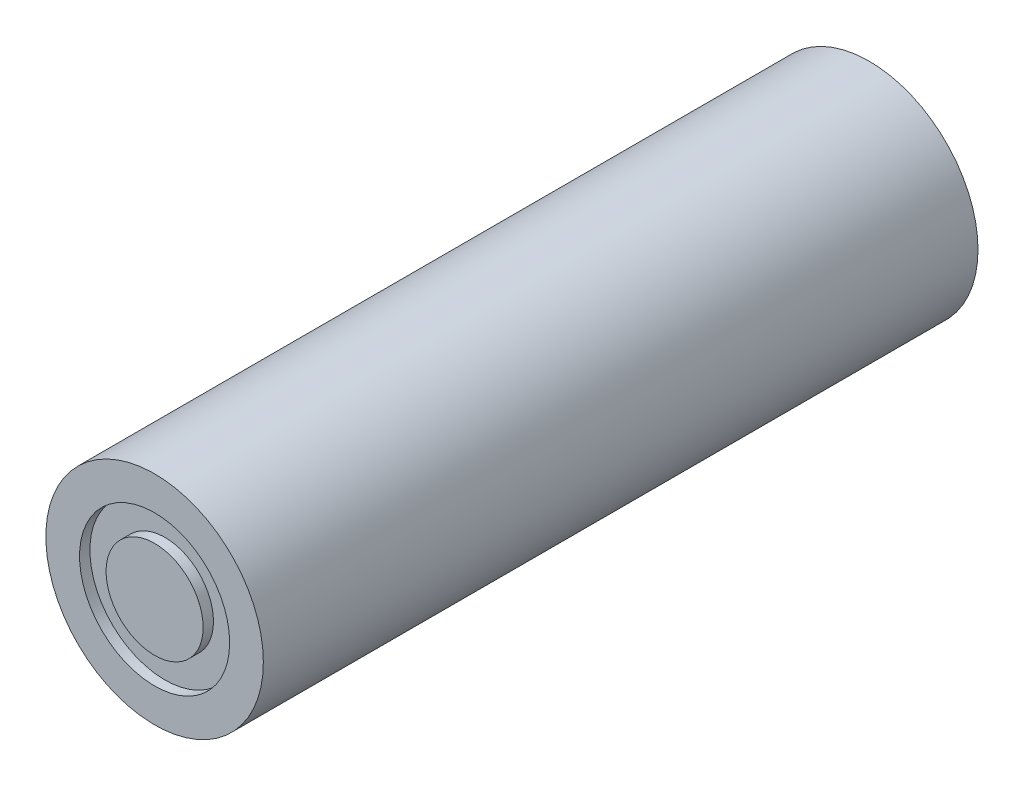
ISO-10303-21;
HEADER;
FILE_DESCRIPTION(('STEP AP214'),'2;1');
FILE_NAME('part.step','',(''),(''),'','','');
FILE_SCHEMA(('AUTOMOTIVE_DESIGN { 1 0 10303 214 1 1 1 1 }'));
ENDSEC;
DATA;
#1=APPLICATION_CONTEXT('core data for automotive mechanical design processes');
#2=APPLICATION_PROTOCOL_DEFINITION('international standard','automotive_design',2000,#1);
#3=PRODUCT_CONTEXT('',#1,'mechanical');
#4=PRODUCT('Part','Part','',(#3));
#5=PRODUCT_RELATED_PRODUCT_CATEGORY('part','',(#4));
#6=PRODUCT_DEFINITION_FORMATION('','',#4);
#7=PRODUCT_DEFINITION_CONTEXT('part definition',#1,'design');
#8=PRODUCT_DEFINITION('design','',#6,#7);
#9=PRODUCT_DEFINITION_SHAPE('','',#8);
#10=(LENGTH_UNIT() NAMED_UNIT(*) SI_UNIT(.MILLI.,.METRE.));
#11=(NAMED_UNIT(*) PLANE_ANGLE_UNIT() SI_UNIT($,.RADIAN.));
#12=(NAMED_UNIT(*) SI_UNIT($,.STERADIAN.) SOLID_ANGLE_UNIT());
#13=UNCERTAINTY_MEASURE_WITH_UNIT(LENGTH_MEASURE(1.E-05),#10,'distance_accuracy_value','');
#14=(GEOMETRIC_REPRESENTATION_CONTEXT(3) GLOBAL_UNCERTAINTY_ASSIGNED_CONTEXT((#13)) GLOBAL_UNIT_ASSIGNED_CONTEXT((#10,
#11,#12)) REPRESENTATION_CONTEXT('',''));
#15=CARTESIAN_POINT('',(0.,0.,0.));
#16=DIRECTION('',(0.,0.,1.));
#17=DIRECTION('',(1.,0.,0.));
#18=AXIS2_PLACEMENT_3D('',#15,#16,#17);
#19=CARTESIAN_POINT('',(0.,0.,35.075));
#20=DIRECTION('',(0.,0.,-1.));
#21=DIRECTION('',(-1.00000000000001,0.,0.));
#22=AXIS2_PLACEMENT_3D('',#19,#20,#21);
#23=CYLINDRICAL_SURFACE('',#22,10.674999986);
#24=CARTESIAN_POINT('',(0.,0.,35.075));
#25=DIRECTION('',(0.,0.,1.));
#26=DIRECTION('',(1.00000000000001,0.,0.));
#27=AXIS2_PLACEMENT_3D('',#24,#25,#26);
#28=CIRCLE('',#27,10.674999986);
#29=CARTESIAN_POINT('',(10.6749999860001,0.,35.075));
#30=VERTEX_POINT('',#29);
#31=EDGE_CURVE('E10',#30,#30,#28,.T.);
#32=ORIENTED_EDGE('',*,*,#31,.F.);
#33=EDGE_LOOP('',(#32));
#34=FACE_BOUND('',#33,.T.);
#35=CARTESIAN_POINT('',(0.,0.,-35.075));
#36=DIRECTION('',(0.,0.,1.));
#37=DIRECTION('',(1.00000000000001,0.,0.));
#38=AXIS2_PLACEMENT_3D('',#35,#36,#37);
#39=CIRCLE('',#38,10.674999986);
#40=CARTESIAN_POINT('',(10.6749999860001,0.,-35.075));
#41=VERTEX_POINT('',#40);
#42=EDGE_CURVE('E52',#41,#41,#39,.T.);
#43=ORIENTED_EDGE('',*,*,#42,.T.);
#44=EDGE_LOOP('',(#43));
#45=FACE_BOUND('',#44,.T.);
#46=ADVANCED_FACE('F49',(#34,#45),#23,.T.);
#47=CARTESIAN_POINT('',(0.,0.,35.075));
#48=DIRECTION('',(0.,0.,1.));
#49=DIRECTION('',(1.00000000000001,0.,0.));
#50=AXIS2_PLACEMENT_3D('',#47,#48,#49);
#51=PLANE('',#50);
#52=CARTESIAN_POINT('',(0.,0.,35.075));
#53=DIRECTION('',(0.,0.,1.));
#54=DIRECTION('',(1.00000000000001,0.,0.));
#55=AXIS2_PLACEMENT_3D('',#52,#53,#54);
#56=CIRCLE('',#55,7.366);
#57=CARTESIAN_POINT('',(7.36600000000004,0.,35.075));
#58=VERTEX_POINT('',#57);
#59=EDGE_CURVE('E65',#58,#58,#56,.T.);
#60=ORIENTED_EDGE('',*,*,#59,.F.);
#61=EDGE_LOOP('',(#60));
#62=FACE_BOUND('',#61,.T.);
#63=ORIENTED_EDGE('',*,*,#31,.T.);
#64=EDGE_LOOP('',(#63));
#65=FACE_BOUND('',#64,.T.);
#66=ADVANCED_FACE('F97',(#62,#65),#51,.T.);
#67=CARTESIAN_POINT('',(0.,0.,-35.075));
#68=DIRECTION('',(0.,0.,1.));
#69=DIRECTION('',(1.00000000000001,0.,0.));
#70=AXIS2_PLACEMENT_3D('',#67,#68,#69);
#71=PLANE('',#70);
#72=ORIENTED_EDGE('',*,*,#42,.F.);
#73=EDGE_LOOP('',(#72));
#74=FACE_BOUND('',#73,.T.);
#75=ADVANCED_FACE('F93',(#74),#71,.F.);
#76=CARTESIAN_POINT('',(0.,0.,34.059));
#77=DIRECTION('',(0.,0.,1.));
#78=DIRECTION('',(1.00000000000001,0.,0.));
#79=AXIS2_PLACEMENT_3D('',#76,#77,#78);
#80=CYLINDRICAL_SURFACE('',#79,7.366);
#81=CARTESIAN_POINT('',(0.,0.,34.059));
#82=DIRECTION('',(0.,0.,1.));
#83=DIRECTION('',(1.00000000000001,0.,0.));
#84=AXIS2_PLACEMENT_3D('',#81,#82,#83);
#85=CIRCLE('',#84,7.366);
#86=CARTESIAN_POINT('',(7.36600000000004,0.,34.059));
#87=VERTEX_POINT('',#86);
#88=EDGE_CURVE('E63',#87,#87,#85,.T.);
#89=ORIENTED_EDGE('',*,*,#88,.F.);
#90=EDGE_LOOP('',(#89));
#91=FACE_BOUND('',#90,.T.);
#92=ORIENTED_EDGE('',*,*,#59,.T.);
#93=EDGE_LOOP('',(#92));
#94=FACE_BOUND('',#93,.T.);
#95=ADVANCED_FACE('F87',(#91,#94),#80,.F.);
#96=CARTESIAN_POINT('',(0.,0.,34.059));
#97=DIRECTION('',(0.,0.,1.));
#98=DIRECTION('',(1.00000000000001,0.,0.));
#99=AXIS2_PLACEMENT_3D('',#96,#97,#98);
#100=PLANE('',#99);
#101=CARTESIAN_POINT('',(0.,0.,34.059));
#102=DIRECTION('',(0.,0.,1.));
#103=DIRECTION('',(1.00000000000001,0.,0.));
#104=AXIS2_PLACEMENT_3D('',#101,#102,#103);
#105=CIRCLE('',#104,4.7625);
#106=CARTESIAN_POINT('',(4.76250000000003,0.,34.059));
#107=VERTEX_POINT('',#106);
#108=EDGE_CURVE('E68',#107,#107,#105,.T.);
#109=ORIENTED_EDGE('',*,*,#108,.F.);
#110=EDGE_LOOP('',(#109));
#111=FACE_BOUND('',#110,.T.);
#112=ORIENTED_EDGE('',*,*,#88,.T.);
#113=EDGE_LOOP('',(#112));
#114=FACE_BOUND('',#113,.T.);
#115=ADVANCED_FACE('F84',(#111,#114),#100,.T.);
#116=CARTESIAN_POINT('',(0.,0.,34.059));
#117=DIRECTION('',(0.,0.,1.));
#118=DIRECTION('',(1.00000000000001,0.,0.));
#119=AXIS2_PLACEMENT_3D('',#116,#117,#118);
#120=CYLINDRICAL_SURFACE('',#119,4.7625);
#121=ORIENTED_EDGE('',*,*,#108,.T.);
#122=EDGE_LOOP('',(#121));
#123=FACE_BOUND('',#122,.T.);
#124=CARTESIAN_POINT('',(0.,0.,35.075));
#125=DIRECTION('',(0.,0.,1.));
#126=DIRECTION('',(1.00000000000001,0.,0.));
#127=AXIS2_PLACEMENT_3D('',#124,#125,#126);
#128=CIRCLE('',#127,4.7625);
#129=CARTESIAN_POINT('',(4.76250000000003,0.,35.075));
#130=VERTEX_POINT('',#129);
#131=EDGE_CURVE('E72',#130,#130,#128,.T.);
#132=ORIENTED_EDGE('',*,*,#131,.F.);
#133=EDGE_LOOP('',(#132));
#134=FACE_BOUND('',#133,.T.);
#135=ADVANCED_FACE('F81',(#123,#134),#120,.T.);
#136=ORIENTED_EDGE('',*,*,#131,.T.);
#137=EDGE_LOOP('',(#136));
#138=FACE_BOUND('',#137,.T.);
#139=ADVANCED_FACE('F100',(#138),#51,.T.);
#140=CLOSED_SHELL('',(#46,#66,#75,#95,#115,#135,#139));
#141=MANIFOLD_SOLID_BREP('B2',#140);
#142=ADVANCED_BREP_SHAPE_REPRESENTATION('',(#18,#141),#14);
#143=SHAPE_DEFINITION_REPRESENTATION(#9,#142);
ENDSEC;
END-ISO-10303-21;
